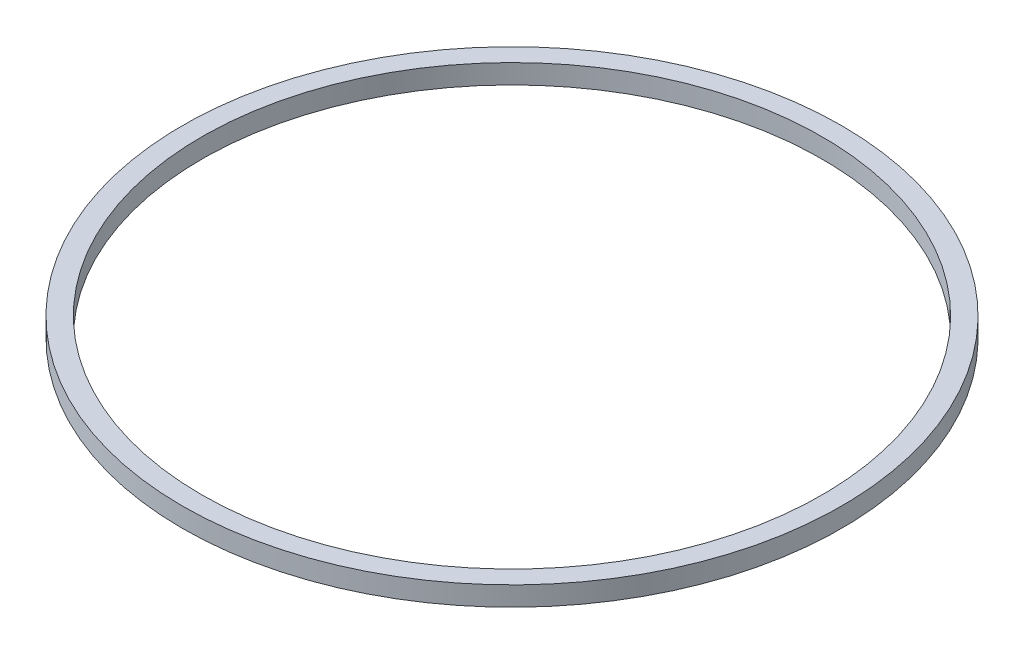
ISO-10303-21;
HEADER;
FILE_DESCRIPTION(('STEP AP214'),'2;1');
FILE_NAME('part.step','',(''),(''),'','','');
FILE_SCHEMA(('AUTOMOTIVE_DESIGN { 1 0 10303 214 1 1 1 1 }'));
ENDSEC;
DATA;
#1=APPLICATION_CONTEXT('core data for automotive mechanical design processes');
#2=APPLICATION_PROTOCOL_DEFINITION('international standard','automotive_design',2000,#1);
#3=PRODUCT_CONTEXT('',#1,'mechanical');
#4=PRODUCT('Part','Part','',(#3));
#5=PRODUCT_RELATED_PRODUCT_CATEGORY('part','',(#4));
#6=PRODUCT_DEFINITION_FORMATION('','',#4);
#7=PRODUCT_DEFINITION_CONTEXT('part definition',#1,'design');
#8=PRODUCT_DEFINITION('design','',#6,#7);
#9=PRODUCT_DEFINITION_SHAPE('','',#8);
#10=(LENGTH_UNIT() NAMED_UNIT(*) SI_UNIT(.MILLI.,.METRE.));
#11=(NAMED_UNIT(*) PLANE_ANGLE_UNIT() SI_UNIT($,.RADIAN.));
#12=(NAMED_UNIT(*) SI_UNIT($,.STERADIAN.) SOLID_ANGLE_UNIT());
#13=UNCERTAINTY_MEASURE_WITH_UNIT(LENGTH_MEASURE(1.E-05),#10,'distance_accuracy_value','');
#14=(GEOMETRIC_REPRESENTATION_CONTEXT(3) GLOBAL_UNCERTAINTY_ASSIGNED_CONTEXT((#13)) GLOBAL_UNIT_ASSIGNED_CONTEXT((#10,
#11,#12)) REPRESENTATION_CONTEXT('',''));
#15=CARTESIAN_POINT('',(0.,0.,0.));
#16=DIRECTION('',(0.,0.,1.));
#17=DIRECTION('',(1.,0.,0.));
#18=AXIS2_PLACEMENT_3D('',#15,#16,#17);
#19=CARTESIAN_POINT('',(0.,10.,0.));
#20=DIRECTION('',(0.,1.,0.));
#21=DIRECTION('',(0.,0.,1.));
#22=AXIS2_PLACEMENT_3D('',#19,#20,#21);
#23=PLANE('',#22);
#24=CARTESIAN_POINT('',(0.,10.,0.));
#25=DIRECTION('',(0.,1.,0.));
#26=DIRECTION('',(0.,0.,1.));
#27=AXIS2_PLACEMENT_3D('',#24,#25,#26);
#28=CIRCLE('',#27,170.);
#29=CARTESIAN_POINT('',(0.,10.,170.));
#30=VERTEX_POINT('',#29);
#31=EDGE_CURVE('E10',#30,#30,#28,.T.);
#32=ORIENTED_EDGE('',*,*,#31,.T.);
#33=EDGE_LOOP('',(#32));
#34=FACE_BOUND('',#33,.T.);
#35=CARTESIAN_POINT('',(0.,10.,0.));
#36=DIRECTION('',(0.,1.,0.));
#37=DIRECTION('',(0.,0.,1.));
#38=AXIS2_PLACEMENT_3D('',#35,#36,#37);
#39=CIRCLE('',#38,160.);
#40=CARTESIAN_POINT('',(0.,10.,160.));
#41=VERTEX_POINT('',#40);
#42=EDGE_CURVE('E50',#41,#41,#39,.T.);
#43=ORIENTED_EDGE('',*,*,#42,.F.);
#44=EDGE_LOOP('',(#43));
#45=FACE_BOUND('',#44,.T.);
#46=ADVANCED_FACE('F37',(#34,#45),#23,.T.);
#47=CARTESIAN_POINT('',(0.,0.,0.));
#48=DIRECTION('',(0.,1.,0.));
#49=DIRECTION('',(0.,0.,1.));
#50=AXIS2_PLACEMENT_3D('',#47,#48,#49);
#51=PLANE('',#50);
#52=CARTESIAN_POINT('',(0.,0.,0.));
#53=DIRECTION('',(0.,1.,0.));
#54=DIRECTION('',(0.,0.,1.));
#55=AXIS2_PLACEMENT_3D('',#52,#53,#54);
#56=CIRCLE('',#55,170.);
#57=CARTESIAN_POINT('',(0.,0.,170.));
#58=VERTEX_POINT('',#57);
#59=EDGE_CURVE('E41',#58,#58,#56,.T.);
#60=ORIENTED_EDGE('',*,*,#59,.F.);
#61=EDGE_LOOP('',(#60));
#62=FACE_BOUND('',#61,.T.);
#63=CARTESIAN_POINT('',(0.,0.,0.));
#64=DIRECTION('',(0.,1.,0.));
#65=DIRECTION('',(0.,0.,1.));
#66=AXIS2_PLACEMENT_3D('',#63,#64,#65);
#67=CIRCLE('',#66,160.);
#68=CARTESIAN_POINT('',(0.,0.,160.));
#69=VERTEX_POINT('',#68);
#70=EDGE_CURVE('E52',#69,#69,#67,.T.);
#71=ORIENTED_EDGE('',*,*,#70,.T.);
#72=EDGE_LOOP('',(#71));
#73=FACE_BOUND('',#72,.T.);
#74=ADVANCED_FACE('F64',(#62,#73),#51,.F.);
#75=CARTESIAN_POINT('',(0.,10.,0.));
#76=DIRECTION('',(0.,-1.,0.));
#77=DIRECTION('',(0.,0.,-1.));
#78=AXIS2_PLACEMENT_3D('',#75,#76,#77);
#79=CYLINDRICAL_SURFACE('',#78,170.);
#80=ORIENTED_EDGE('',*,*,#31,.F.);
#81=EDGE_LOOP('',(#80));
#82=FACE_BOUND('',#81,.T.);
#83=ORIENTED_EDGE('',*,*,#59,.T.);
#84=EDGE_LOOP('',(#83));
#85=FACE_BOUND('',#84,.T.);
#86=ADVANCED_FACE('F39',(#82,#85),#79,.T.);
#87=CARTESIAN_POINT('',(0.,10.,0.));
#88=DIRECTION('',(0.,-1.,0.));
#89=DIRECTION('',(0.,0.,-1.));
#90=AXIS2_PLACEMENT_3D('',#87,#88,#89);
#91=CYLINDRICAL_SURFACE('',#90,160.);
#92=ORIENTED_EDGE('',*,*,#42,.T.);
#93=EDGE_LOOP('',(#92));
#94=FACE_BOUND('',#93,.T.);
#95=ORIENTED_EDGE('',*,*,#70,.F.);
#96=EDGE_LOOP('',(#95));
#97=FACE_BOUND('',#96,.T.);
#98=ADVANCED_FACE('F60',(#94,#97),#91,.F.);
#99=CLOSED_SHELL('',(#46,#74,#86,#98));
#100=MANIFOLD_SOLID_BREP('B2',#99);
#101=ADVANCED_BREP_SHAPE_REPRESENTATION('',(#18,#100),#14);
#102=SHAPE_DEFINITION_REPRESENTATION(#9,#101);
ENDSEC;
END-ISO-10303-21;
